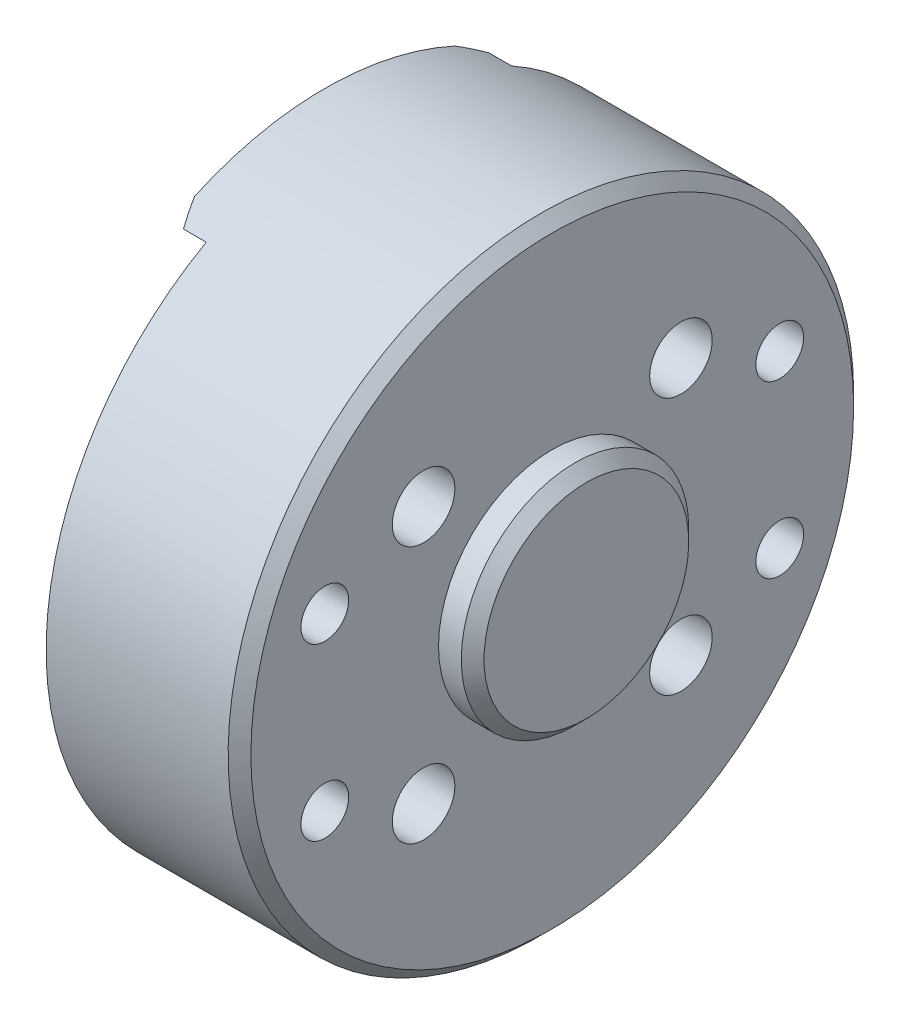
ISO-10303-21;
HEADER;
FILE_DESCRIPTION(('STEP AP214'),'2;1');
FILE_NAME('part.step','',(''),(''),'','','');
FILE_SCHEMA(('AUTOMOTIVE_DESIGN { 1 0 10303 214 1 1 1 1 }'));
ENDSEC;
DATA;
#1=APPLICATION_CONTEXT('core data for automotive mechanical design processes');
#2=APPLICATION_PROTOCOL_DEFINITION('international standard','automotive_design',2000,#1);
#3=PRODUCT_CONTEXT('',#1,'mechanical');
#4=PRODUCT('Part','Part','',(#3));
#5=PRODUCT_RELATED_PRODUCT_CATEGORY('part','',(#4));
#6=PRODUCT_DEFINITION_FORMATION('','',#4);
#7=PRODUCT_DEFINITION_CONTEXT('part definition',#1,'design');
#8=PRODUCT_DEFINITION('design','',#6,#7);
#9=PRODUCT_DEFINITION_SHAPE('','',#8);
#10=(LENGTH_UNIT() NAMED_UNIT(*) SI_UNIT(.MILLI.,.METRE.));
#11=(NAMED_UNIT(*) PLANE_ANGLE_UNIT() SI_UNIT($,.RADIAN.));
#12=(NAMED_UNIT(*) SI_UNIT($,.STERADIAN.) SOLID_ANGLE_UNIT());
#13=UNCERTAINTY_MEASURE_WITH_UNIT(LENGTH_MEASURE(1.E-05),#10,'distance_accuracy_value','');
#14=(GEOMETRIC_REPRESENTATION_CONTEXT(3) GLOBAL_UNCERTAINTY_ASSIGNED_CONTEXT((#13)) GLOBAL_UNIT_ASSIGNED_CONTEXT((#10,
#11,#12)) REPRESENTATION_CONTEXT('',''));
#15=CARTESIAN_POINT('',(0.,0.,0.));
#16=DIRECTION('',(0.,0.,1.));
#17=DIRECTION('',(1.,0.,0.));
#18=AXIS2_PLACEMENT_3D('',#15,#16,#17);
#19=CARTESIAN_POINT('',(-10.,0.,0.));
#20=DIRECTION('',(1.,0.,0.));
#21=DIRECTION('',(0.,0.,-1.));
#22=AXIS2_PLACEMENT_3D('',#19,#20,#21);
#23=PLANE('',#22);
#24=CARTESIAN_POINT('',(-10.,0.,0.));
#25=DIRECTION('',(1.,0.,0.));
#26=DIRECTION('',(0.,0.,-1.));
#27=AXIS2_PLACEMENT_3D('',#24,#25,#26);
#28=CIRCLE('',#27,27.5);
#29=CARTESIAN_POINT('',(-10.,25.,-11.4564392373896));
#30=VERTEX_POINT('',#29);
#31=CARTESIAN_POINT('',(-10.,25.,11.4564392373896));
#32=VERTEX_POINT('',#31);
#33=EDGE_CURVE('E169',#30,#32,#28,.T.);
#34=ORIENTED_EDGE('',*,*,#33,.F.);
#35=DIRECTION('',(0.,0.,1.));
#36=VECTOR('',#35,1.);
#37=CARTESIAN_POINT('',(-10.,25.,0.));
#38=LINE('',#37,#36);
#39=EDGE_CURVE('E190',#30,#32,#38,.T.);
#40=ORIENTED_EDGE('',*,*,#39,.T.);
#41=EDGE_LOOP('',(#34,#40));
#42=FACE_BOUND('',#41,.T.);
#43=ADVANCED_FACE('F36',(#42),#23,.F.);
#44=CARTESIAN_POINT('',(0.,11.3137084989847,-11.3137084989848));
#45=DIRECTION('',(-1.,0.,0.));
#46=DIRECTION('',(0.,0.,1.));
#47=AXIS2_PLACEMENT_3D('',#44,#45,#46);
#48=CYLINDRICAL_SURFACE('',#47,5.);
#49=CARTESIAN_POINT('',(0.,11.3137084989847,-11.3137084989848));
#50=DIRECTION('',(-1.,0.,0.));
#51=DIRECTION('',(0.,0.,1.));
#52=AXIS2_PLACEMENT_3D('',#49,#50,#51);
#53=CIRCLE('',#52,5.);
#54=CARTESIAN_POINT('',(0.,11.3137084989847,-6.31370849898482));
#55=VERTEX_POINT('',#54);
#56=EDGE_CURVE('E148',#55,#55,#53,.T.);
#57=ORIENTED_EDGE('',*,*,#56,.F.);
#58=EDGE_LOOP('',(#57));
#59=FACE_BOUND('',#58,.T.);
#60=CARTESIAN_POINT('',(-7.,11.3137084989847,-11.3137084989848));
#61=DIRECTION('',(-1.,0.,0.));
#62=DIRECTION('',(0.,0.,1.));
#63=AXIS2_PLACEMENT_3D('',#60,#61,#62);
#64=CIRCLE('',#63,5.);
#65=CARTESIAN_POINT('',(-7.,11.3137084989847,-6.31370849898482));
#66=VERTEX_POINT('',#65);
#67=EDGE_CURVE('E112',#66,#66,#64,.F.);
#68=ORIENTED_EDGE('',*,*,#67,.F.);
#69=EDGE_LOOP('',(#68));
#70=FACE_BOUND('',#69,.T.);
#71=ADVANCED_FACE('F218',(#59,#70),#48,.F.);
#72=CARTESIAN_POINT('',(0.,-11.3137084989849,-11.3137084989847));
#73=DIRECTION('',(-1.,0.,0.));
#74=DIRECTION('',(0.,0.,1.));
#75=AXIS2_PLACEMENT_3D('',#72,#73,#74);
#76=CYLINDRICAL_SURFACE('',#75,5.);
#77=CARTESIAN_POINT('',(0.,-11.3137084989849,-11.3137084989847));
#78=DIRECTION('',(-1.,0.,0.));
#79=DIRECTION('',(0.,1.,0.));
#80=AXIS2_PLACEMENT_3D('',#77,#78,#79);
#81=CIRCLE('',#80,5.);
#82=CARTESIAN_POINT('',(0.,-6.31370849898486,-11.3137084989847));
#83=VERTEX_POINT('',#82);
#84=EDGE_CURVE('E144',#83,#83,#81,.T.);
#85=ORIENTED_EDGE('',*,*,#84,.F.);
#86=EDGE_LOOP('',(#85));
#87=FACE_BOUND('',#86,.T.);
#88=CARTESIAN_POINT('',(-7.,-11.3137084989849,-11.3137084989847));
#89=DIRECTION('',(-1.,0.,0.));
#90=DIRECTION('',(0.,0.,1.));
#91=AXIS2_PLACEMENT_3D('',#88,#89,#90);
#92=CIRCLE('',#91,5.);
#93=CARTESIAN_POINT('',(-7.,-11.3137084989849,-6.31370849898466));
#94=VERTEX_POINT('',#93);
#95=EDGE_CURVE('E127',#94,#94,#92,.F.);
#96=ORIENTED_EDGE('',*,*,#95,.F.);
#97=EDGE_LOOP('',(#96));
#98=FACE_BOUND('',#97,.T.);
#99=ADVANCED_FACE('F225',(#87,#98),#76,.F.);
#100=CARTESIAN_POINT('',(0.,-11.3137084989847,11.3137084989848));
#101=DIRECTION('',(-1.,0.,0.));
#102=DIRECTION('',(0.,0.,1.));
#103=AXIS2_PLACEMENT_3D('',#100,#101,#102);
#104=CYLINDRICAL_SURFACE('',#103,5.);
#105=CARTESIAN_POINT('',(0.,-11.3137084989847,11.3137084989848));
#106=DIRECTION('',(-1.,0.,0.));
#107=DIRECTION('',(0.,0.,-1.));
#108=AXIS2_PLACEMENT_3D('',#105,#106,#107);
#109=CIRCLE('',#108,5.);
#110=CARTESIAN_POINT('',(0.,-11.3137084989847,6.31370849898482));
#111=VERTEX_POINT('',#110);
#112=EDGE_CURVE('E140',#111,#111,#109,.T.);
#113=ORIENTED_EDGE('',*,*,#112,.F.);
#114=EDGE_LOOP('',(#113));
#115=FACE_BOUND('',#114,.T.);
#116=CARTESIAN_POINT('',(-7.,-11.3137084989847,11.3137084989848));
#117=DIRECTION('',(-1.,0.,0.));
#118=DIRECTION('',(0.,0.,1.));
#119=AXIS2_PLACEMENT_3D('',#116,#117,#118);
#120=CIRCLE('',#119,5.);
#121=CARTESIAN_POINT('',(-7.,-11.3137084989847,16.3137084989848));
#122=VERTEX_POINT('',#121);
#123=EDGE_CURVE('E119',#122,#122,#120,.F.);
#124=ORIENTED_EDGE('',*,*,#123,.F.);
#125=EDGE_LOOP('',(#124));
#126=FACE_BOUND('',#125,.T.);
#127=ADVANCED_FACE('F267',(#115,#126),#104,.F.);
#128=CARTESIAN_POINT('',(0.,11.3137084989849,11.3137084989846));
#129=DIRECTION('',(-1.,0.,0.));
#130=DIRECTION('',(0.,0.,1.));
#131=AXIS2_PLACEMENT_3D('',#128,#129,#130);
#132=CYLINDRICAL_SURFACE('',#131,5.);
#133=CARTESIAN_POINT('',(0.,11.3137084989849,11.3137084989846));
#134=DIRECTION('',(-1.,0.,0.));
#135=DIRECTION('',(0.,-1.,0.));
#136=AXIS2_PLACEMENT_3D('',#133,#134,#135);
#137=CIRCLE('',#136,5.);
#138=CARTESIAN_POINT('',(0.,6.31370849898494,11.3137084989846));
#139=VERTEX_POINT('',#138);
#140=EDGE_CURVE('E136',#139,#139,#137,.T.);
#141=ORIENTED_EDGE('',*,*,#140,.F.);
#142=EDGE_LOOP('',(#141));
#143=FACE_BOUND('',#142,.T.);
#144=CARTESIAN_POINT('',(-7.,11.3137084989849,11.3137084989846));
#145=DIRECTION('',(-1.,0.,0.));
#146=DIRECTION('',(0.,0.,1.));
#147=AXIS2_PLACEMENT_3D('',#144,#145,#146);
#148=CIRCLE('',#147,5.);
#149=CARTESIAN_POINT('',(-7.,11.3137084989849,16.3137084989846));
#150=VERTEX_POINT('',#149);
#151=EDGE_CURVE('E116',#150,#150,#148,.F.);
#152=ORIENTED_EDGE('',*,*,#151,.F.);
#153=EDGE_LOOP('',(#152));
#154=FACE_BOUND('',#153,.T.);
#155=ADVANCED_FACE('F263',(#143,#154),#132,.F.);
#156=CARTESIAN_POINT('',(20.,11.3137084989848,11.3137084989847));
#157=DIRECTION('',(-1.,0.,0.));
#158=DIRECTION('',(0.,0.,1.));
#159=AXIS2_PLACEMENT_3D('',#156,#157,#158);
#160=CYLINDRICAL_SURFACE('',#159,2.75);
#161=CARTESIAN_POINT('',(10.,11.3137084989848,11.3137084989847));
#162=DIRECTION('',(1.,0.,0.));
#163=DIRECTION('',(0.,0.,-1.));
#164=AXIS2_PLACEMENT_3D('',#161,#162,#163);
#165=CIRCLE('',#164,2.75);
#166=CARTESIAN_POINT('',(10.,11.3137084989848,8.56370849898474));
#167=VERTEX_POINT('',#166);
#168=EDGE_CURVE('E161',#167,#167,#165,.T.);
#169=ORIENTED_EDGE('',*,*,#168,.T.);
#170=EDGE_LOOP('',(#169));
#171=FACE_BOUND('',#170,.T.);
#172=CARTESIAN_POINT('',(0.,11.3137084989848,11.3137084989847));
#173=DIRECTION('',(-1.,0.,0.));
#174=DIRECTION('',(0.,0.,1.));
#175=AXIS2_PLACEMENT_3D('',#172,#173,#174);
#176=CIRCLE('',#175,2.75);
#177=CARTESIAN_POINT('',(0.,11.3137084989848,14.0637084989847));
#178=VERTEX_POINT('',#177);
#179=EDGE_CURVE('E139',#178,#178,#176,.F.);
#180=ORIENTED_EDGE('',*,*,#179,.F.);
#181=EDGE_LOOP('',(#180));
#182=FACE_BOUND('',#181,.T.);
#183=ADVANCED_FACE('F266',(#171,#182),#160,.F.);
#184=CARTESIAN_POINT('',(20.,-11.3137084989846,11.3137084989849));
#185=DIRECTION('',(-1.,0.,0.));
#186=DIRECTION('',(0.,0.,1.));
#187=AXIS2_PLACEMENT_3D('',#184,#185,#186);
#188=CYLINDRICAL_SURFACE('',#187,2.75);
#189=CARTESIAN_POINT('',(10.,-11.3137084989846,11.3137084989849));
#190=DIRECTION('',(1.,0.,0.));
#191=DIRECTION('',(0.,0.,-1.));
#192=AXIS2_PLACEMENT_3D('',#189,#190,#191);
#193=CIRCLE('',#192,2.75);
#194=CARTESIAN_POINT('',(10.,-11.3137084989846,8.5637084989849));
#195=VERTEX_POINT('',#194);
#196=EDGE_CURVE('E152',#195,#195,#193,.T.);
#197=ORIENTED_EDGE('',*,*,#196,.T.);
#198=EDGE_LOOP('',(#197));
#199=FACE_BOUND('',#198,.T.);
#200=CARTESIAN_POINT('',(0.,-11.3137084989846,11.3137084989849));
#201=DIRECTION('',(-1.,0.,0.));
#202=DIRECTION('',(0.,0.,1.));
#203=AXIS2_PLACEMENT_3D('',#200,#201,#202);
#204=CIRCLE('',#203,2.75);
#205=CARTESIAN_POINT('',(0.,-11.3137084989846,14.0637084989849));
#206=VERTEX_POINT('',#205);
#207=EDGE_CURVE('E143',#206,#206,#204,.F.);
#208=ORIENTED_EDGE('',*,*,#207,.F.);
#209=EDGE_LOOP('',(#208));
#210=FACE_BOUND('',#209,.T.);
#211=ADVANCED_FACE('F286',(#199,#210),#188,.F.);
#212=CARTESIAN_POINT('',(20.,-11.3137084989848,-11.3137084989847));
#213=DIRECTION('',(-1.,0.,0.));
#214=DIRECTION('',(0.,0.,1.));
#215=AXIS2_PLACEMENT_3D('',#212,#213,#214);
#216=CYLINDRICAL_SURFACE('',#215,2.75);
#217=CARTESIAN_POINT('',(10.,-11.3137084989848,-11.3137084989847));
#218=DIRECTION('',(1.,0.,0.));
#219=DIRECTION('',(0.,0.,-1.));
#220=AXIS2_PLACEMENT_3D('',#217,#218,#219);
#221=CIRCLE('',#220,2.75);
#222=CARTESIAN_POINT('',(10.,-11.3137084989848,-14.0637084989847));
#223=VERTEX_POINT('',#222);
#224=EDGE_CURVE('E155',#223,#223,#221,.T.);
#225=ORIENTED_EDGE('',*,*,#224,.T.);
#226=EDGE_LOOP('',(#225));
#227=FACE_BOUND('',#226,.T.);
#228=CARTESIAN_POINT('',(0.,-11.3137084989848,-11.3137084989847));
#229=DIRECTION('',(-1.,0.,0.));
#230=DIRECTION('',(0.,0.,1.));
#231=AXIS2_PLACEMENT_3D('',#228,#229,#230);
#232=CIRCLE('',#231,2.75);
#233=CARTESIAN_POINT('',(0.,-11.3137084989848,-8.56370849898474));
#234=VERTEX_POINT('',#233);
#235=EDGE_CURVE('E147',#234,#234,#232,.F.);
#236=ORIENTED_EDGE('',*,*,#235,.F.);
#237=EDGE_LOOP('',(#236));
#238=FACE_BOUND('',#237,.T.);
#239=ADVANCED_FACE('F289',(#227,#238),#216,.F.);
#240=CARTESIAN_POINT('',(20.,11.3137084989847,-11.3137084989848));
#241=DIRECTION('',(-1.,0.,0.));
#242=DIRECTION('',(0.,0.,1.));
#243=AXIS2_PLACEMENT_3D('',#240,#241,#242);
#244=CYLINDRICAL_SURFACE('',#243,2.75);
#245=CARTESIAN_POINT('',(10.,11.3137084989847,-11.3137084989848));
#246=DIRECTION('',(1.,0.,0.));
#247=DIRECTION('',(0.,0.,-1.));
#248=AXIS2_PLACEMENT_3D('',#245,#246,#247);
#249=CIRCLE('',#248,2.75);
#250=CARTESIAN_POINT('',(10.,11.3137084989847,-14.0637084989848));
#251=VERTEX_POINT('',#250);
#252=EDGE_CURVE('E158',#251,#251,#249,.T.);
#253=ORIENTED_EDGE('',*,*,#252,.T.);
#254=EDGE_LOOP('',(#253));
#255=FACE_BOUND('',#254,.T.);
#256=CARTESIAN_POINT('',(0.,11.3137084989847,-11.3137084989848));
#257=DIRECTION('',(-1.,0.,0.));
#258=DIRECTION('',(0.,0.,1.));
#259=AXIS2_PLACEMENT_3D('',#256,#257,#258);
#260=CIRCLE('',#259,2.75);
#261=CARTESIAN_POINT('',(0.,11.3137084989847,-8.56370849898482));
#262=VERTEX_POINT('',#261);
#263=EDGE_CURVE('E151',#262,#262,#260,.F.);
#264=ORIENTED_EDGE('',*,*,#263,.F.);
#265=EDGE_LOOP('',(#264));
#266=FACE_BOUND('',#265,.T.);
#267=ADVANCED_FACE('F293',(#255,#266),#244,.F.);
#268=CARTESIAN_POINT('',(10.,0.,0.));
#269=DIRECTION('',(1.,0.,0.));
#270=DIRECTION('',(0.,0.,-1.));
#271=AXIS2_PLACEMENT_3D('',#268,#269,#270);
#272=PLANE('',#271);
#273=CARTESIAN_POINT('',(10.,7.5,20.));
#274=DIRECTION('',(1.,0.,0.));
#275=DIRECTION('',(0.,0.,-1.));
#276=AXIS2_PLACEMENT_3D('',#273,#274,#275);
#277=CIRCLE('',#276,2.1);
#278=CARTESIAN_POINT('',(10.,7.5,17.9));
#279=VERTEX_POINT('',#278);
#280=EDGE_CURVE('E310',#279,#279,#277,.T.);
#281=ORIENTED_EDGE('',*,*,#280,.F.);
#282=EDGE_LOOP('',(#281));
#283=FACE_BOUND('',#282,.T.);
#284=CARTESIAN_POINT('',(10.,-7.5,20.));
#285=DIRECTION('',(1.,0.,0.));
#286=DIRECTION('',(0.,0.,-1.));
#287=AXIS2_PLACEMENT_3D('',#284,#285,#286);
#288=CIRCLE('',#287,2.1);
#289=CARTESIAN_POINT('',(10.,-7.5,17.9));
#290=VERTEX_POINT('',#289);
#291=EDGE_CURVE('E314',#290,#290,#288,.T.);
#292=ORIENTED_EDGE('',*,*,#291,.F.);
#293=EDGE_LOOP('',(#292));
#294=FACE_BOUND('',#293,.T.);
#295=CARTESIAN_POINT('',(10.,7.5,-20.));
#296=DIRECTION('',(1.,0.,0.));
#297=DIRECTION('',(0.,0.,-1.));
#298=AXIS2_PLACEMENT_3D('',#295,#296,#297);
#299=CIRCLE('',#298,2.1);
#300=CARTESIAN_POINT('',(10.,7.5,-22.1));
#301=VERTEX_POINT('',#300);
#302=EDGE_CURVE('E318',#301,#301,#299,.T.);
#303=ORIENTED_EDGE('',*,*,#302,.F.);
#304=EDGE_LOOP('',(#303));
#305=FACE_BOUND('',#304,.T.);
#306=CARTESIAN_POINT('',(10.,-7.5,-20.));
#307=DIRECTION('',(1.,0.,0.));
#308=DIRECTION('',(0.,0.,-1.));
#309=AXIS2_PLACEMENT_3D('',#306,#307,#308);
#310=CIRCLE('',#309,2.1);
#311=CARTESIAN_POINT('',(10.,-7.5,-22.1));
#312=VERTEX_POINT('',#311);
#313=EDGE_CURVE('E121',#312,#312,#310,.T.);
#314=ORIENTED_EDGE('',*,*,#313,.F.);
#315=EDGE_LOOP('',(#314));
#316=FACE_BOUND('',#315,.T.);
#317=CARTESIAN_POINT('',(10.,0.,0.));
#318=DIRECTION('',(1.,0.,0.));
#319=DIRECTION('',(0.,0.,-1.));
#320=AXIS2_PLACEMENT_3D('',#317,#318,#319);
#321=CIRCLE('',#320,26.5);
#322=CARTESIAN_POINT('',(10.,0.,-26.5));
#323=VERTEX_POINT('',#322);
#324=EDGE_CURVE('E44',#323,#323,#321,.T.);
#325=ORIENTED_EDGE('',*,*,#324,.T.);
#326=EDGE_LOOP('',(#325));
#327=FACE_BOUND('',#326,.T.);
#328=ORIENTED_EDGE('',*,*,#196,.F.);
#329=EDGE_LOOP('',(#328));
#330=FACE_BOUND('',#329,.T.);
#331=ORIENTED_EDGE('',*,*,#224,.F.);
#332=EDGE_LOOP('',(#331));
#333=FACE_BOUND('',#332,.T.);
#334=ORIENTED_EDGE('',*,*,#252,.F.);
#335=EDGE_LOOP('',(#334));
#336=FACE_BOUND('',#335,.T.);
#337=ORIENTED_EDGE('',*,*,#168,.F.);
#338=EDGE_LOOP('',(#337));
#339=FACE_BOUND('',#338,.T.);
#340=CARTESIAN_POINT('',(10.,0.,0.));
#341=DIRECTION('',(1.,0.,0.));
#342=DIRECTION('',(0.,0.,-1.));
#343=AXIS2_PLACEMENT_3D('',#340,#341,#342);
#344=CIRCLE('',#343,10.);
#345=CARTESIAN_POINT('',(10.,0.,-10.));
#346=VERTEX_POINT('',#345);
#347=EDGE_CURVE('E164',#346,#346,#344,.T.);
#348=ORIENTED_EDGE('',*,*,#347,.F.);
#349=EDGE_LOOP('',(#348));
#350=FACE_BOUND('',#349,.T.);
#351=ADVANCED_FACE('F200',(#283,#294,#305,#316,#327,#330,#333,#336,#339,#350),#272,.T.);
#352=CARTESIAN_POINT('',(10.,0.,0.));
#353=DIRECTION('',(-1.,0.,0.));
#354=DIRECTION('',(0.,0.,1.));
#355=AXIS2_PLACEMENT_3D('',#352,#353,#354);
#356=CYLINDRICAL_SURFACE('',#355,27.5);
#357=CARTESIAN_POINT('',(9.,0.,0.));
#358=DIRECTION('',(1.,0.,0.));
#359=DIRECTION('',(0.,0.,-1.));
#360=AXIS2_PLACEMENT_3D('',#357,#358,#359);
#361=CIRCLE('',#360,27.5);
#362=CARTESIAN_POINT('',(9.,0.,-27.5));
#363=VERTEX_POINT('',#362);
#364=EDGE_CURVE('E11',#363,#363,#361,.F.);
#365=ORIENTED_EDGE('',*,*,#364,.T.);
#366=EDGE_LOOP('',(#365));
#367=FACE_BOUND('',#366,.T.);
#368=DIRECTION('',(-1.,0.,0.));
#369=VECTOR('',#368,1.);
#370=CARTESIAN_POINT('',(10.,-24.,13.4257215820975));
#371=LINE('',#370,#369);
#372=CARTESIAN_POINT('',(-7.,-24.,13.4257215820975));
#373=VERTEX_POINT('',#372);
#374=CARTESIAN_POINT('',(-8.99999999999999,-24.,13.4257215820975));
#375=VERTEX_POINT('',#374);
#376=EDGE_CURVE('E100',#373,#375,#371,.T.);
#377=ORIENTED_EDGE('',*,*,#376,.T.);
#378=CARTESIAN_POINT('',(15.,0.,0.));
#379=DIRECTION('',(0.707106781186547,-0.707106781186547,0.));
#380=DIRECTION('',(-0.707106781186548,-0.707106781186548,0.));
#381=AXIS2_PLACEMENT_3D('',#378,#379,#380);
#382=ELLIPSE('',#381,38.8908729652601,27.5);
#383=CARTESIAN_POINT('',(-10.,-25.,11.4564392373896));
#384=VERTEX_POINT('',#383);
#385=EDGE_CURVE('E57',#375,#384,#382,.T.);
#386=ORIENTED_EDGE('',*,*,#385,.T.);
#387=CARTESIAN_POINT('',(-10.,-25.,-11.4564392373896));
#388=VERTEX_POINT('',#387);
#389=EDGE_CURVE('E167',#384,#388,#28,.T.);
#390=ORIENTED_EDGE('',*,*,#389,.T.);
#391=CARTESIAN_POINT('',(15.,0.,0.));
#392=DIRECTION('',(0.707106781186547,-0.707106781186547,0.));
#393=DIRECTION('',(-0.707106781186548,-0.707106781186548,0.));
#394=AXIS2_PLACEMENT_3D('',#391,#392,#393);
#395=ELLIPSE('',#394,38.8908729652601,27.5);
#396=CARTESIAN_POINT('',(-8.99999999999999,-24.,-13.4257215820975));
#397=VERTEX_POINT('',#396);
#398=EDGE_CURVE('E184',#388,#397,#395,.T.);
#399=ORIENTED_EDGE('',*,*,#398,.T.);
#400=DIRECTION('',(-1.,0.,0.));
#401=VECTOR('',#400,1.);
#402=CARTESIAN_POINT('',(10.,-24.,-13.4257215820975));
#403=LINE('',#402,#401);
#404=CARTESIAN_POINT('',(-7.,-24.,-13.4257215820975));
#405=VERTEX_POINT('',#404);
#406=EDGE_CURVE('E132',#397,#405,#403,.F.);
#407=ORIENTED_EDGE('',*,*,#406,.T.);
#408=CARTESIAN_POINT('',(-7.,0.,0.));
#409=DIRECTION('',(-1.,0.,0.));
#410=DIRECTION('',(0.,0.,1.));
#411=AXIS2_PLACEMENT_3D('',#408,#409,#410);
#412=CIRCLE('',#411,27.5);
#413=CARTESIAN_POINT('',(-7.,24.,-13.4257215820975));
#414=VERTEX_POINT('',#413);
#415=EDGE_CURVE('E111',#414,#405,#412,.T.);
#416=ORIENTED_EDGE('',*,*,#415,.F.);
#417=DIRECTION('',(-1.,0.,0.));
#418=VECTOR('',#417,1.);
#419=CARTESIAN_POINT('',(10.,24.,-13.4257215820975));
#420=LINE('',#419,#418);
#421=CARTESIAN_POINT('',(-8.99999999999999,24.,-13.4257215820975));
#422=VERTEX_POINT('',#421);
#423=EDGE_CURVE('E99',#414,#422,#420,.T.);
#424=ORIENTED_EDGE('',*,*,#423,.T.);
#425=CARTESIAN_POINT('',(15.,0.,0.));
#426=DIRECTION('',(0.707106781186547,0.707106781186547,0.));
#427=DIRECTION('',(-0.707106781186548,0.707106781186548,0.));
#428=AXIS2_PLACEMENT_3D('',#425,#426,#427);
#429=ELLIPSE('',#428,38.8908729652601,27.5);
#430=EDGE_CURVE('E182',#422,#30,#429,.T.);
#431=ORIENTED_EDGE('',*,*,#430,.T.);
#432=ORIENTED_EDGE('',*,*,#33,.T.);
#433=CARTESIAN_POINT('',(15.,0.,0.));
#434=DIRECTION('',(0.707106781186547,0.707106781186547,0.));
#435=DIRECTION('',(-0.707106781186548,0.707106781186548,0.));
#436=AXIS2_PLACEMENT_3D('',#433,#434,#435);
#437=ELLIPSE('',#436,38.8908729652601,27.5);
#438=CARTESIAN_POINT('',(-8.99999999999999,24.,13.4257215820975));
#439=VERTEX_POINT('',#438);
#440=EDGE_CURVE('E94',#32,#439,#437,.T.);
#441=ORIENTED_EDGE('',*,*,#440,.T.);
#442=DIRECTION('',(-1.,0.,0.));
#443=VECTOR('',#442,1.);
#444=CARTESIAN_POINT('',(10.,24.,13.4257215820975));
#445=LINE('',#444,#443);
#446=CARTESIAN_POINT('',(-7.,24.,13.4257215820975));
#447=VERTEX_POINT('',#446);
#448=EDGE_CURVE('E88',#439,#447,#445,.F.);
#449=ORIENTED_EDGE('',*,*,#448,.T.);
#450=EDGE_CURVE('E91',#373,#447,#412,.T.);
#451=ORIENTED_EDGE('',*,*,#450,.F.);
#452=EDGE_LOOP('',(#377,#386,#390,#399,#407,#416,#424,#431,#432,#441,#449,#451));
#453=FACE_BOUND('',#452,.T.);
#454=ADVANCED_FACE('F90',(#367,#453),#356,.T.);
#455=ORIENTED_EDGE('',*,*,#389,.F.);
#456=DIRECTION('',(0.,0.,-1.));
#457=VECTOR('',#456,1.);
#458=CARTESIAN_POINT('',(-10.,-25.,0.));
#459=LINE('',#458,#457);
#460=EDGE_CURVE('E50',#384,#388,#459,.T.);
#461=ORIENTED_EDGE('',*,*,#460,.T.);
#462=EDGE_LOOP('',(#455,#461));
#463=FACE_BOUND('',#462,.T.);
#464=ADVANCED_FACE('F221',(#463),#23,.F.);
#465=CARTESIAN_POINT('',(13.,0.,0.));
#466=DIRECTION('',(-1.,0.,0.));
#467=DIRECTION('',(0.,0.,1.));
#468=AXIS2_PLACEMENT_3D('',#465,#466,#467);
#469=CYLINDRICAL_SURFACE('',#468,10.);
#470=CARTESIAN_POINT('',(12.,0.,0.));
#471=DIRECTION('',(1.,0.,0.));
#472=DIRECTION('',(0.,0.,-1.));
#473=AXIS2_PLACEMENT_3D('',#470,#471,#472);
#474=CIRCLE('',#473,10.);
#475=CARTESIAN_POINT('',(12.,0.,-10.));
#476=VERTEX_POINT('',#475);
#477=EDGE_CURVE('E195',#476,#476,#474,.F.);
#478=ORIENTED_EDGE('',*,*,#477,.T.);
#479=EDGE_LOOP('',(#478));
#480=FACE_BOUND('',#479,.T.);
#481=ORIENTED_EDGE('',*,*,#347,.T.);
#482=EDGE_LOOP('',(#481));
#483=FACE_BOUND('',#482,.T.);
#484=ADVANCED_FACE('F232',(#480,#483),#469,.T.);
#485=CARTESIAN_POINT('',(13.,0.,0.));
#486=DIRECTION('',(1.,0.,0.));
#487=DIRECTION('',(0.,0.,-1.));
#488=AXIS2_PLACEMENT_3D('',#485,#486,#487);
#489=PLANE('',#488);
#490=CARTESIAN_POINT('',(13.,0.,0.));
#491=DIRECTION('',(1.,0.,0.));
#492=DIRECTION('',(0.,0.,-1.));
#493=AXIS2_PLACEMENT_3D('',#490,#491,#492);
#494=CIRCLE('',#493,9.00000000000001);
#495=CARTESIAN_POINT('',(13.,0.,-9.00000000000001));
#496=VERTEX_POINT('',#495);
#497=EDGE_CURVE('E192',#496,#496,#494,.T.);
#498=ORIENTED_EDGE('',*,*,#497,.T.);
#499=EDGE_LOOP('',(#498));
#500=FACE_BOUND('',#499,.T.);
#501=ADVANCED_FACE('F237',(#500),#489,.T.);
#502=CARTESIAN_POINT('',(0.,11.3137084989847,-11.3137084989848));
#503=DIRECTION('',(-1.,0.,0.));
#504=DIRECTION('',(0.,0.,1.));
#505=AXIS2_PLACEMENT_3D('',#502,#503,#504);
#506=PLANE('',#505);
#507=ORIENTED_EDGE('',*,*,#56,.T.);
#508=EDGE_LOOP('',(#507));
#509=FACE_BOUND('',#508,.T.);
#510=ORIENTED_EDGE('',*,*,#263,.T.);
#511=EDGE_LOOP('',(#510));
#512=FACE_BOUND('',#511,.T.);
#513=ADVANCED_FACE('F278',(#509,#512),#506,.T.);
#514=CARTESIAN_POINT('',(0.,-11.3137084989849,-11.3137084989847));
#515=DIRECTION('',(-1.,0.,0.));
#516=DIRECTION('',(0.,1.,0.));
#517=AXIS2_PLACEMENT_3D('',#514,#515,#516);
#518=PLANE('',#517);
#519=ORIENTED_EDGE('',*,*,#84,.T.);
#520=EDGE_LOOP('',(#519));
#521=FACE_BOUND('',#520,.T.);
#522=ORIENTED_EDGE('',*,*,#235,.T.);
#523=EDGE_LOOP('',(#522));
#524=FACE_BOUND('',#523,.T.);
#525=ADVANCED_FACE('F271',(#521,#524),#518,.T.);
#526=CARTESIAN_POINT('',(0.,-11.3137084989847,11.3137084989848));
#527=DIRECTION('',(-1.,0.,0.));
#528=DIRECTION('',(0.,0.,-1.));
#529=AXIS2_PLACEMENT_3D('',#526,#527,#528);
#530=PLANE('',#529);
#531=ORIENTED_EDGE('',*,*,#112,.T.);
#532=EDGE_LOOP('',(#531));
#533=FACE_BOUND('',#532,.T.);
#534=ORIENTED_EDGE('',*,*,#207,.T.);
#535=EDGE_LOOP('',(#534));
#536=FACE_BOUND('',#535,.T.);
#537=ADVANCED_FACE('F261',(#533,#536),#530,.T.);
#538=CARTESIAN_POINT('',(0.,11.3137084989849,11.3137084989846));
#539=DIRECTION('',(-1.,0.,0.));
#540=DIRECTION('',(0.,-1.,0.));
#541=AXIS2_PLACEMENT_3D('',#538,#539,#540);
#542=PLANE('',#541);
#543=ORIENTED_EDGE('',*,*,#140,.T.);
#544=EDGE_LOOP('',(#543));
#545=FACE_BOUND('',#544,.T.);
#546=ORIENTED_EDGE('',*,*,#179,.T.);
#547=EDGE_LOOP('',(#546));
#548=FACE_BOUND('',#547,.T.);
#549=ADVANCED_FACE('F256',(#545,#548),#542,.T.);
#550=CARTESIAN_POINT('',(-7.,24.,-28.988773546551));
#551=DIRECTION('',(0.,1.,0.));
#552=DIRECTION('',(0.,0.,1.));
#553=AXIS2_PLACEMENT_3D('',#550,#551,#552);
#554=PLANE('',#553);
#555=ORIENTED_EDGE('',*,*,#448,.F.);
#556=DIRECTION('',(0.,0.,-1.));
#557=VECTOR('',#556,1.);
#558=CARTESIAN_POINT('',(-8.99999999999999,24.,-28.988773546551));
#559=LINE('',#558,#557);
#560=EDGE_CURVE('E188',#439,#422,#559,.T.);
#561=ORIENTED_EDGE('',*,*,#560,.T.);
#562=ORIENTED_EDGE('',*,*,#423,.F.);
#563=DIRECTION('',(0.,0.,-1.));
#564=VECTOR('',#563,1.);
#565=CARTESIAN_POINT('',(-7.,24.,-28.988773546551));
#566=LINE('',#565,#564);
#567=EDGE_CURVE('E107',#447,#414,#566,.T.);
#568=ORIENTED_EDGE('',*,*,#567,.F.);
#569=EDGE_LOOP('',(#555,#561,#562,#568));
#570=FACE_BOUND('',#569,.T.);
#571=ADVANCED_FACE('F114',(#570),#554,.F.);
#572=CARTESIAN_POINT('',(-7.,-24.,-28.988773546551));
#573=DIRECTION('',(0.,-1.,0.));
#574=DIRECTION('',(0.,0.,-1.));
#575=AXIS2_PLACEMENT_3D('',#572,#573,#574);
#576=PLANE('',#575);
#577=ORIENTED_EDGE('',*,*,#406,.F.);
#578=DIRECTION('',(0.,0.,1.));
#579=VECTOR('',#578,1.);
#580=CARTESIAN_POINT('',(-8.99999999999999,-24.,-28.988773546551));
#581=LINE('',#580,#579);
#582=EDGE_CURVE('E178',#397,#375,#581,.T.);
#583=ORIENTED_EDGE('',*,*,#582,.T.);
#584=ORIENTED_EDGE('',*,*,#376,.F.);
#585=DIRECTION('',(0.,0.,1.));
#586=VECTOR('',#585,1.);
#587=CARTESIAN_POINT('',(-7.,-24.,-28.988773546551));
#588=LINE('',#587,#586);
#589=EDGE_CURVE('E110',#405,#373,#588,.T.);
#590=ORIENTED_EDGE('',*,*,#589,.F.);
#591=EDGE_LOOP('',(#577,#583,#584,#590));
#592=FACE_BOUND('',#591,.T.);
#593=ADVANCED_FACE('F247',(#592),#576,.F.);
#594=CARTESIAN_POINT('',(-7.,0.,0.));
#595=DIRECTION('',(-1.,0.,0.));
#596=DIRECTION('',(0.,0.,1.));
#597=AXIS2_PLACEMENT_3D('',#594,#595,#596);
#598=PLANE('',#597);
#599=CARTESIAN_POINT('',(-7.,7.5,20.));
#600=DIRECTION('',(-1.,0.,0.));
#601=DIRECTION('',(0.,0.,1.));
#602=AXIS2_PLACEMENT_3D('',#599,#600,#601);
#603=CIRCLE('',#602,2.1);
#604=CARTESIAN_POINT('',(-7.,7.5,22.1));
#605=VERTEX_POINT('',#604);
#606=EDGE_CURVE('E334',#605,#605,#603,.T.);
#607=ORIENTED_EDGE('',*,*,#606,.F.);
#608=EDGE_LOOP('',(#607));
#609=FACE_BOUND('',#608,.T.);
#610=CARTESIAN_POINT('',(-7.,-7.5,20.));
#611=DIRECTION('',(-1.,0.,0.));
#612=DIRECTION('',(0.,0.,1.));
#613=AXIS2_PLACEMENT_3D('',#610,#611,#612);
#614=CIRCLE('',#613,2.1);
#615=CARTESIAN_POINT('',(-7.,-7.5,22.1));
#616=VERTEX_POINT('',#615);
#617=EDGE_CURVE('E330',#616,#616,#614,.T.);
#618=ORIENTED_EDGE('',*,*,#617,.F.);
#619=EDGE_LOOP('',(#618));
#620=FACE_BOUND('',#619,.T.);
#621=CARTESIAN_POINT('',(-7.,7.5,-20.));
#622=DIRECTION('',(-1.,0.,0.));
#623=DIRECTION('',(0.,0.,1.));
#624=AXIS2_PLACEMENT_3D('',#621,#622,#623);
#625=CIRCLE('',#624,2.1);
#626=CARTESIAN_POINT('',(-7.,7.5,-17.9));
#627=VERTEX_POINT('',#626);
#628=EDGE_CURVE('E326',#627,#627,#625,.T.);
#629=ORIENTED_EDGE('',*,*,#628,.F.);
#630=EDGE_LOOP('',(#629));
#631=FACE_BOUND('',#630,.T.);
#632=CARTESIAN_POINT('',(-7.,-7.5,-20.));
#633=DIRECTION('',(-1.,0.,0.));
#634=DIRECTION('',(0.,0.,1.));
#635=AXIS2_PLACEMENT_3D('',#632,#633,#634);
#636=CIRCLE('',#635,2.1);
#637=CARTESIAN_POINT('',(-7.,-7.5,-17.9));
#638=VERTEX_POINT('',#637);
#639=EDGE_CURVE('E321',#638,#638,#636,.T.);
#640=ORIENTED_EDGE('',*,*,#639,.F.);
#641=EDGE_LOOP('',(#640));
#642=FACE_BOUND('',#641,.T.);
#643=ORIENTED_EDGE('',*,*,#95,.T.);
#644=EDGE_LOOP('',(#643));
#645=FACE_BOUND('',#644,.T.);
#646=ORIENTED_EDGE('',*,*,#151,.T.);
#647=EDGE_LOOP('',(#646));
#648=FACE_BOUND('',#647,.T.);
#649=ORIENTED_EDGE('',*,*,#123,.T.);
#650=EDGE_LOOP('',(#649));
#651=FACE_BOUND('',#650,.T.);
#652=ORIENTED_EDGE('',*,*,#67,.T.);
#653=EDGE_LOOP('',(#652));
#654=FACE_BOUND('',#653,.T.);
#655=ORIENTED_EDGE('',*,*,#415,.T.);
#656=ORIENTED_EDGE('',*,*,#589,.T.);
#657=ORIENTED_EDGE('',*,*,#450,.T.);
#658=ORIENTED_EDGE('',*,*,#567,.T.);
#659=EDGE_LOOP('',(#655,#656,#657,#658));
#660=FACE_BOUND('',#659,.T.);
#661=ADVANCED_FACE('F106',(#609,#620,#631,#642,#645,#648,#651,#654,#660),#598,.T.);
#662=CARTESIAN_POINT('',(-8.99999999999999,-24.,-28.988773546551));
#663=DIRECTION('',(0.707106781186547,-0.707106781186547,0.));
#664=DIRECTION('',(0.,0.,1.));
#665=AXIS2_PLACEMENT_3D('',#662,#663,#664);
#666=PLANE('',#665);
#667=ORIENTED_EDGE('',*,*,#398,.F.);
#668=ORIENTED_EDGE('',*,*,#460,.F.);
#669=ORIENTED_EDGE('',*,*,#385,.F.);
#670=ORIENTED_EDGE('',*,*,#582,.F.);
#671=EDGE_LOOP('',(#667,#668,#669,#670));
#672=FACE_BOUND('',#671,.T.);
#673=ADVANCED_FACE('F243',(#672),#666,.F.);
#674=CARTESIAN_POINT('',(-8.99999999999999,24.,-28.988773546551));
#675=DIRECTION('',(0.707106781186547,0.707106781186547,0.));
#676=DIRECTION('',(0.,0.,-1.));
#677=AXIS2_PLACEMENT_3D('',#674,#675,#676);
#678=PLANE('',#677);
#679=ORIENTED_EDGE('',*,*,#440,.F.);
#680=ORIENTED_EDGE('',*,*,#39,.F.);
#681=ORIENTED_EDGE('',*,*,#430,.F.);
#682=ORIENTED_EDGE('',*,*,#560,.F.);
#683=EDGE_LOOP('',(#679,#680,#681,#682));
#684=FACE_BOUND('',#683,.T.);
#685=ADVANCED_FACE('F214',(#684),#678,.F.);
#686=CARTESIAN_POINT('',(13.,0.,0.));
#687=DIRECTION('',(-1.,0.,0.));
#688=DIRECTION('',(0.,0.,1.));
#689=AXIS2_PLACEMENT_3D('',#686,#687,#688);
#690=CONICAL_SURFACE('',#689,9.00000000000001,0.785398163397446);
#691=ORIENTED_EDGE('',*,*,#477,.F.);
#692=EDGE_LOOP('',(#691));
#693=FACE_BOUND('',#692,.T.);
#694=ORIENTED_EDGE('',*,*,#497,.F.);
#695=EDGE_LOOP('',(#694));
#696=FACE_BOUND('',#695,.T.);
#697=ADVANCED_FACE('F205',(#693,#696),#690,.T.);
#698=CARTESIAN_POINT('',(10.,0.,0.));
#699=DIRECTION('',(-1.,0.,0.));
#700=DIRECTION('',(0.,0.,1.));
#701=AXIS2_PLACEMENT_3D('',#698,#699,#700);
#702=CONICAL_SURFACE('',#701,26.5,0.785398163397445);
#703=ORIENTED_EDGE('',*,*,#364,.F.);
#704=EDGE_LOOP('',(#703));
#705=FACE_BOUND('',#704,.T.);
#706=ORIENTED_EDGE('',*,*,#324,.F.);
#707=EDGE_LOOP('',(#706));
#708=FACE_BOUND('',#707,.T.);
#709=ADVANCED_FACE('F38',(#705,#708),#702,.T.);
#710=CARTESIAN_POINT('',(-7.,-7.5,-20.));
#711=DIRECTION('',(-1.,0.,0.));
#712=DIRECTION('',(0.,0.,1.));
#713=AXIS2_PLACEMENT_3D('',#710,#711,#712);
#714=CYLINDRICAL_SURFACE('',#713,2.1);
#715=ORIENTED_EDGE('',*,*,#313,.T.);
#716=EDGE_LOOP('',(#715));
#717=FACE_BOUND('',#716,.T.);
#718=ORIENTED_EDGE('',*,*,#639,.T.);
#719=EDGE_LOOP('',(#718));
#720=FACE_BOUND('',#719,.T.);
#721=ADVANCED_FACE('F204',(#717,#720),#714,.F.);
#722=CARTESIAN_POINT('',(-7.,7.5,-20.));
#723=DIRECTION('',(-1.,0.,0.));
#724=DIRECTION('',(0.,0.,1.));
#725=AXIS2_PLACEMENT_3D('',#722,#723,#724);
#726=CYLINDRICAL_SURFACE('',#725,2.1);
#727=ORIENTED_EDGE('',*,*,#302,.T.);
#728=EDGE_LOOP('',(#727));
#729=FACE_BOUND('',#728,.T.);
#730=ORIENTED_EDGE('',*,*,#628,.T.);
#731=EDGE_LOOP('',(#730));
#732=FACE_BOUND('',#731,.T.);
#733=ADVANCED_FACE('F211',(#729,#732),#726,.F.);
#734=CARTESIAN_POINT('',(-7.,-7.5,20.));
#735=DIRECTION('',(-1.,0.,0.));
#736=DIRECTION('',(0.,0.,1.));
#737=AXIS2_PLACEMENT_3D('',#734,#735,#736);
#738=CYLINDRICAL_SURFACE('',#737,2.1);
#739=ORIENTED_EDGE('',*,*,#291,.T.);
#740=EDGE_LOOP('',(#739));
#741=FACE_BOUND('',#740,.T.);
#742=ORIENTED_EDGE('',*,*,#617,.T.);
#743=EDGE_LOOP('',(#742));
#744=FACE_BOUND('',#743,.T.);
#745=ADVANCED_FACE('F360',(#741,#744),#738,.F.);
#746=CARTESIAN_POINT('',(-7.,7.5,20.));
#747=DIRECTION('',(-1.,0.,0.));
#748=DIRECTION('',(0.,0.,1.));
#749=AXIS2_PLACEMENT_3D('',#746,#747,#748);
#750=CYLINDRICAL_SURFACE('',#749,2.1);
#751=ORIENTED_EDGE('',*,*,#280,.T.);
#752=EDGE_LOOP('',(#751));
#753=FACE_BOUND('',#752,.T.);
#754=ORIENTED_EDGE('',*,*,#606,.T.);
#755=EDGE_LOOP('',(#754));
#756=FACE_BOUND('',#755,.T.);
#757=ADVANCED_FACE('F338',(#753,#756),#750,.F.);
#758=CLOSED_SHELL('',(#43,#71,#99,#127,#155,#183,#211,#239,#267,#351,#454,#464,#484,#501,#513,
#525,#537,#549,#571,#593,#661,#673,#685,#697,#709,#721,#733,#745,#757));
#759=MANIFOLD_SOLID_BREP('B2',#758);
#760=ADVANCED_BREP_SHAPE_REPRESENTATION('',(#18,#759),#14);
#761=SHAPE_DEFINITION_REPRESENTATION(#9,#760);
ENDSEC;
END-ISO-10303-21;
